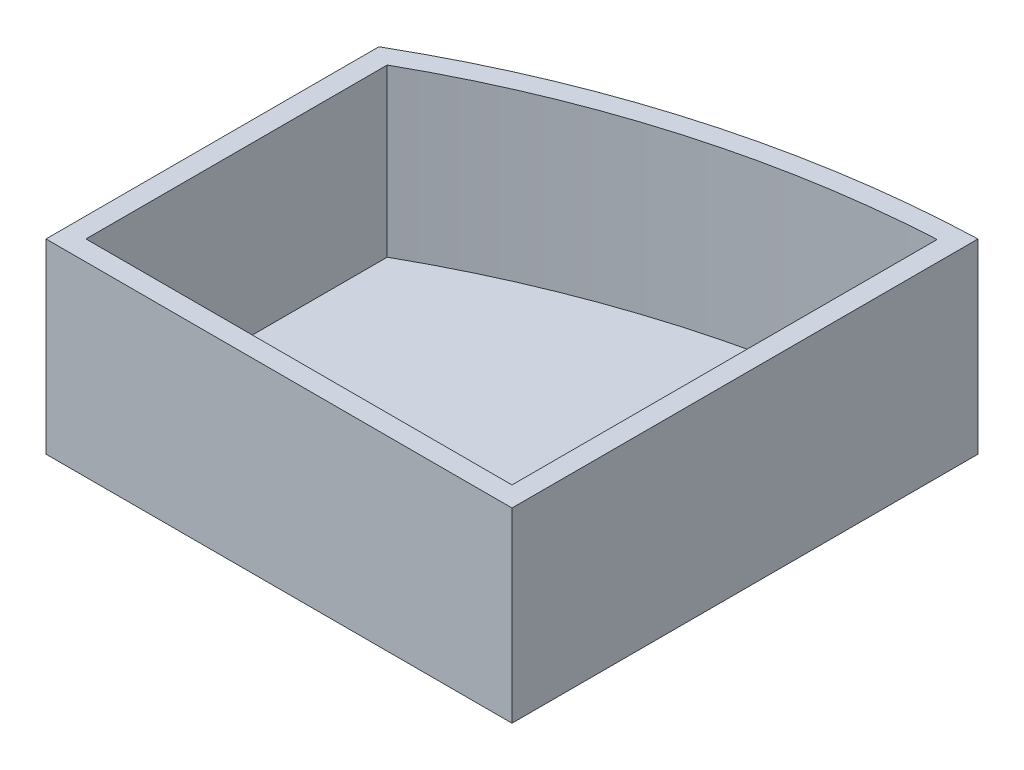
ISO-10303-21;
HEADER;
FILE_DESCRIPTION(('STEP AP214'),'2;1');
FILE_NAME('part.step','',(''),(''),'','','');
FILE_SCHEMA(('AUTOMOTIVE_DESIGN { 1 0 10303 214 1 1 1 1 }'));
ENDSEC;
DATA;
#1=APPLICATION_CONTEXT('core data for automotive mechanical design processes');
#2=APPLICATION_PROTOCOL_DEFINITION('international standard','automotive_design',2000,#1);
#3=PRODUCT_CONTEXT('',#1,'mechanical');
#4=PRODUCT('Part','Part','',(#3));
#5=PRODUCT_RELATED_PRODUCT_CATEGORY('part','',(#4));
#6=PRODUCT_DEFINITION_FORMATION('','',#4);
#7=PRODUCT_DEFINITION_CONTEXT('part definition',#1,'design');
#8=PRODUCT_DEFINITION('design','',#6,#7);
#9=PRODUCT_DEFINITION_SHAPE('','',#8);
#10=(LENGTH_UNIT() NAMED_UNIT(*) SI_UNIT(.MILLI.,.METRE.));
#11=(NAMED_UNIT(*) PLANE_ANGLE_UNIT() SI_UNIT($,.RADIAN.));
#12=(NAMED_UNIT(*) SI_UNIT($,.STERADIAN.) SOLID_ANGLE_UNIT());
#13=UNCERTAINTY_MEASURE_WITH_UNIT(LENGTH_MEASURE(1.E-05),#10,'distance_accuracy_value','');
#14=(GEOMETRIC_REPRESENTATION_CONTEXT(3) GLOBAL_UNCERTAINTY_ASSIGNED_CONTEXT((#13)) GLOBAL_UNIT_ASSIGNED_CONTEXT((#10,
#11,#12)) REPRESENTATION_CONTEXT('',''));
#15=CARTESIAN_POINT('',(0.,0.,0.));
#16=DIRECTION('',(0.,0.,1.));
#17=DIRECTION('',(1.,0.,0.));
#18=AXIS2_PLACEMENT_3D('',#15,#16,#17);
#19=CARTESIAN_POINT('',(4.97640813713975,3.,149.917428479989));
#20=DIRECTION('',(0.,-1.,0.));
#21=DIRECTION('',(0.,0.,-1.));
#22=AXIS2_PLACEMENT_3D('',#19,#20,#21);
#23=CYLINDRICAL_SURFACE('',#22,150.);
#24=CARTESIAN_POINT('',(-39.4352722138977,14.,6.64285764344005));
#25=CARTESIAN_POINT('',(-39.4352661378558,14.1391204526999,6.64285557621836));
#26=CARTESIAN_POINT('',(-39.4240042051214,14.2783424301615,6.63936332595704));
#27=CARTESIAN_POINT('',(-39.3792519349144,14.5529309436153,6.6255028643343));
#28=CARTESIAN_POINT('',(-39.3457348030674,14.6882926268329,6.6151263646228));
#29=CARTESIAN_POINT('',(-39.2574843881743,14.9511203089431,6.5878611484154));
#30=CARTESIAN_POINT('',(-39.2027662481043,15.0785918682179,6.57097708004327));
#31=CARTESIAN_POINT('',(-39.0737390700491,15.3221398232315,6.53127480797521));
#32=CARTESIAN_POINT('',(-38.9994345431717,15.4382188344478,6.50845797072231));
#33=CARTESIAN_POINT('',(-38.8329573921394,15.6564062962142,6.45751392229578));
#34=CARTESIAN_POINT('',(-38.7406956332331,15.7584405307272,6.42936023945238));
#35=CARTESIAN_POINT('',(-38.5411939475037,15.945097380428,6.3687288763975));
#36=CARTESIAN_POINT('',(-38.4339526784349,16.0297184336177,6.33625080870982));
#37=CARTESIAN_POINT('',(-38.2061856577479,16.1802102537094,6.26758377868781));
#38=CARTESIAN_POINT('',(-38.0855196087344,16.2458509252721,6.23135596827087));
#39=CARTESIAN_POINT('',(-37.8353408800564,16.3553578988955,6.15661609087296));
#40=CARTESIAN_POINT('',(-37.7058275890956,16.3992226946271,6.11810386607566));
#41=CARTESIAN_POINT('',(-37.4398337695133,16.4645040087501,6.03941803373275));
#42=CARTESIAN_POINT('',(-37.3032851410003,16.4856251057754,5.99922944469472));
#43=CARTESIAN_POINT('',(-37.0286013117552,16.5039045075355,5.91881854745724));
#44=CARTESIAN_POINT('',(-36.8904660189146,16.5010614140172,5.87859623742716));
#45=CARTESIAN_POINT('',(-36.6152381001323,16.4713863410853,5.7988811964371));
#46=CARTESIAN_POINT('',(-36.4781654784695,16.4443425740435,5.75939805502644));
#47=CARTESIAN_POINT('',(-36.2102141357334,16.3666998886487,5.68261443386599));
#48=CARTESIAN_POINT('',(-36.0793355418299,16.3161004869048,5.64531399892574));
#49=CARTESIAN_POINT('',(-35.8275496404278,16.1926855962764,5.57390014616989));
#50=CARTESIAN_POINT('',(-35.7066426515406,16.1198693978728,5.53978683018406));
#51=CARTESIAN_POINT('',(-35.4783954365672,15.9539736839042,5.47566532901625));
#52=CARTESIAN_POINT('',(-35.3710546049904,15.8608950732052,5.44565696061551));
#53=CARTESIAN_POINT('',(-35.1742563404689,15.6580908236282,5.39084098206329));
#54=CARTESIAN_POINT('',(-35.0846256863533,15.548547009611,5.36598286781711));
#55=CARTESIAN_POINT('',(-34.9246845223087,15.3151746577032,5.32175180257969));
#56=CARTESIAN_POINT('',(-34.8543721685614,15.1913474846782,5.30237832810643));
#57=CARTESIAN_POINT('',(-34.736337432395,14.9351341644833,5.26992057821461));
#58=CARTESIAN_POINT('',(-34.6882581181208,14.8029250404752,5.25673687449463));
#59=CARTESIAN_POINT('',(-34.6145396583722,14.5319432286052,5.23654401755608));
#60=CARTESIAN_POINT('',(-34.588898398147,14.3931711605901,5.22953428245038));
#61=CARTESIAN_POINT('',(-34.5611021297782,14.1151621351127,5.22193619181261));
#62=CARTESIAN_POINT('',(-34.5586119494381,13.975961097865,5.22125619662408));
#63=CARTESIAN_POINT('',(-34.5763214998191,13.6991234024498,5.22609611999887));
#64=CARTESIAN_POINT('',(-34.5965203203031,13.5614866817487,5.23161578984411));
#65=CARTESIAN_POINT('',(-34.6588177928371,13.2922948244945,5.24866927144723));
#66=CARTESIAN_POINT('',(-34.7008203464248,13.160715737541,5.26017669312297));
#67=CARTESIAN_POINT('',(-34.8053500470914,12.9066517240606,5.28888829332322));
#68=CARTESIAN_POINT('',(-34.8678777900923,12.7841670617051,5.30609263725054));
#69=CARTESIAN_POINT('',(-35.0121307774629,12.5506703357806,5.34591545753386));
#70=CARTESIAN_POINT('',(-35.094006230013,12.4397583572231,5.36857632376879));
#71=CARTESIAN_POINT('',(-35.2742303669975,12.2334882771246,5.41865745681315));
#72=CARTESIAN_POINT('',(-35.3725803381574,12.1381313916475,5.4460780953858));
#73=CARTESIAN_POINT('',(-35.584599354374,11.9640543247308,5.50545889802057));
#74=CARTESIAN_POINT('',(-35.6984871900949,11.8856229051472,5.53748433276731));
#75=CARTESIAN_POINT('',(-35.9370795572915,11.7493757492014,5.60491384812774));
#76=CARTESIAN_POINT('',(-36.0617850150802,11.6915617804825,5.64031821810575));
#77=CARTESIAN_POINT('',(-36.3205379932414,11.5972953397285,5.71416706465439));
#78=CARTESIAN_POINT('',(-36.4547005839215,11.5611888292048,5.75265023816349));
#79=CARTESIAN_POINT('',(-36.726820083081,11.5127086733032,5.83113209878094));
#80=CARTESIAN_POINT('',(-36.8647772096191,11.5003363947524,5.87113087303574));
#81=CARTESIAN_POINT('',(-37.1417296113058,11.4996745829474,5.95186510440521));
#82=CARTESIAN_POINT('',(-37.2807244347679,11.511576989214,5.99260388887457));
#83=CARTESIAN_POINT('',(-37.5547007795225,11.5595823865596,6.07332822813733));
#84=CARTESIAN_POINT('',(-37.6896822912173,11.5956854355088,6.11331378112931));
#85=CARTESIAN_POINT('',(-37.9514410612919,11.6910589473878,6.19123608201414));
#86=CARTESIAN_POINT('',(-38.0782370342405,11.7502742123099,6.22917746802595));
#87=CARTESIAN_POINT('',(-38.320273151232,11.8903057957601,6.30192313180717));
#88=CARTESIAN_POINT('',(-38.4355143084968,11.9711202180135,6.33672768461296));
#89=CARTESIAN_POINT('',(-38.6498899237178,12.1511779501889,6.40172008169133));
#90=CARTESIAN_POINT('',(-38.7491805560529,12.2502192007601,6.43195249588405));
#91=CARTESIAN_POINT('',(-38.9301641854204,12.4645551664999,6.48722982131354));
#92=CARTESIAN_POINT('',(-39.0118540000426,12.5798528147692,6.51227379439498));
#93=CARTESIAN_POINT('',(-39.1542158624169,12.821821453772,6.55601972691995));
#94=CARTESIAN_POINT('',(-39.2151404561155,12.9483303149642,6.57479782794521));
#95=CARTESIAN_POINT('',(-39.3154925731034,13.2102351020238,6.605773973985));
#96=CARTESIAN_POINT('',(-39.3549478101924,13.345619316801,6.61798050172232));
#97=CARTESIAN_POINT('',(-39.4004322775486,13.5682683287654,6.63206168406916));
#98=CARTESIAN_POINT('',(-39.4134801463308,13.6540304651104,6.6361041473445));
#99=CARTESIAN_POINT('',(-39.4309019823923,13.8265152427062,6.64150276334896));
#100=CARTESIAN_POINT('',(-39.435276003206,13.9132378780256,6.64285893265768));
#101=CARTESIAN_POINT('',(-39.4352722138977,14.,6.64285764344005));
#102=B_SPLINE_CURVE_WITH_KNOTS('',3,(#24,#25,#26,#27,#28,#29,#30,#31,#32,#33,#34,#35,#36,#37,
#38,#39,#40,#41,#42,#43,#44,#45,#46,#47,#48,#49,#50,#51,#52,#53,#54,#55,#56,#57,#58,#59,#60,#61,
#62,#63,#64,#65,#66,#67,#68,#69,#70,#71,#72,#73,#74,#75,#76,#77,#78,#79,#80,#81,#82,#83,#84,#85,
#86,#87,#88,#89,#90,#91,#92,#93,#94,#95,#96,#97,#98,#99,#100,#101),.UNSPECIFIED.,.T.,.F.,(4,2,2,
2,2,2,2,2,2,2,2,2,2,2,2,2,2,2,2,2,2,2,2,2,2,2,2,2,2,2,2,2,2,2,2,2,2,2,4),(0.,0.417042780520206,
0.834588576588948,1.25183668565513,1.66898877859018,2.0882668872295,2.50758258960009,
2.93178675014822,3.35602025060095,3.78570007582062,4.21540497200092,4.6489075269858,
5.08241897837409,5.51594427589905,5.94945021729386,6.37847970578335,6.80746823169316,
7.22930772131665,7.65110744895569,8.06679084655338,8.48245756836499,8.89630762958837,
9.31016970746893,9.72735701073863,10.1445769132027,10.5684333926567,10.9923262028417,
11.4228070809188,11.8533127491515,12.2872356133682,12.7211595152166,13.1540533729255,
13.5869092376611,14.0152277247741,14.4436235914367,14.8666060505119,15.2890411979366,
15.5491304890054,15.8092181748187),.UNSPECIFIED.);
#103=CARTESIAN_POINT('',(-39.4352722138977,14.,6.64285764344005));
#104=VERTEX_POINT('',#103);
#105=EDGE_CURVE('E129',#104,#104,#102,.T.);
#106=ORIENTED_EDGE('',*,*,#105,.F.);
#107=EDGE_LOOP('',(#106));
#108=FACE_BOUND('',#107,.T.);
#109=CARTESIAN_POINT('',(4.97640813713975,0.,149.917428479989));
#110=DIRECTION('',(0.,1.,0.));
#111=DIRECTION('',(0.,0.,1.));
#112=AXIS2_PLACEMENT_3D('',#109,#110,#111);
#113=CIRCLE('',#112,150.);
#114=CARTESIAN_POINT('',(0.,0.,0.));
#115=VERTEX_POINT('',#114);
#116=CARTESIAN_POINT('',(-70.,0.,20.));
#117=VERTEX_POINT('',#116);
#118=EDGE_CURVE('E150',#115,#117,#113,.T.);
#119=ORIENTED_EDGE('',*,*,#118,.T.);
#120=DIRECTION('',(0.,-1.,0.));
#121=VECTOR('',#120,1.);
#122=CARTESIAN_POINT('',(-70.,3.,20.));
#123=LINE('',#122,#121);
#124=CARTESIAN_POINT('',(-70.,28.,20.));
#125=VERTEX_POINT('',#124);
#126=EDGE_CURVE('E11',#125,#117,#123,.T.);
#127=ORIENTED_EDGE('',*,*,#126,.F.);
#128=CARTESIAN_POINT('',(4.97640813713975,28.,149.917428479989));
#129=DIRECTION('',(0.,1.,0.));
#130=DIRECTION('',(0.,0.,1.));
#131=AXIS2_PLACEMENT_3D('',#128,#129,#130);
#132=CIRCLE('',#131,150.);
#133=CARTESIAN_POINT('',(0.,28.,0.));
#134=VERTEX_POINT('',#133);
#135=EDGE_CURVE('E147',#134,#125,#132,.T.);
#136=ORIENTED_EDGE('',*,*,#135,.F.);
#137=DIRECTION('',(0.,-1.,0.));
#138=VECTOR('',#137,1.);
#139=CARTESIAN_POINT('',(0.,3.,0.));
#140=LINE('',#139,#138);
#141=EDGE_CURVE('E159',#134,#115,#140,.T.);
#142=ORIENTED_EDGE('',*,*,#141,.T.);
#143=EDGE_LOOP('',(#119,#127,#136,#142));
#144=FACE_BOUND('',#143,.T.);
#145=ADVANCED_FACE('F37',(#108,#144),#23,.T.);
#146=CARTESIAN_POINT('',(-70.,3.,70.));
#147=DIRECTION('',(1.,0.,0.));
#148=DIRECTION('',(0.,0.,-1.));
#149=AXIS2_PLACEMENT_3D('',#146,#147,#148);
#150=PLANE('',#149);
#151=DIRECTION('',(0.,0.,1.));
#152=VECTOR('',#151,1.);
#153=CARTESIAN_POINT('',(-70.,0.,70.));
#154=LINE('',#153,#152);
#155=CARTESIAN_POINT('',(-70.,0.,70.));
#156=VERTEX_POINT('',#155);
#157=EDGE_CURVE('E153',#117,#156,#154,.T.);
#158=ORIENTED_EDGE('',*,*,#157,.T.);
#159=DIRECTION('',(0.,-1.,0.));
#160=VECTOR('',#159,1.);
#161=CARTESIAN_POINT('',(-70.,3.,70.));
#162=LINE('',#161,#160);
#163=CARTESIAN_POINT('',(-70.,28.,70.));
#164=VERTEX_POINT('',#163);
#165=EDGE_CURVE('E44',#164,#156,#162,.T.);
#166=ORIENTED_EDGE('',*,*,#165,.F.);
#167=DIRECTION('',(0.,0.,1.));
#168=VECTOR('',#167,1.);
#169=CARTESIAN_POINT('',(-70.,28.,20.));
#170=LINE('',#169,#168);
#171=EDGE_CURVE('E115',#125,#164,#170,.T.);
#172=ORIENTED_EDGE('',*,*,#171,.F.);
#173=ORIENTED_EDGE('',*,*,#126,.T.);
#174=EDGE_LOOP('',(#158,#166,#172,#173));
#175=FACE_BOUND('',#174,.T.);
#176=ADVANCED_FACE('F181',(#175),#150,.F.);
#177=CARTESIAN_POINT('',(0.,3.,70.));
#178=DIRECTION('',(0.,0.,-1.));
#179=DIRECTION('',(-1.,0.,0.));
#180=AXIS2_PLACEMENT_3D('',#177,#178,#179);
#181=PLANE('',#180);
#182=DIRECTION('',(1.,0.,0.));
#183=VECTOR('',#182,1.);
#184=CARTESIAN_POINT('',(0.,0.,70.));
#185=LINE('',#184,#183);
#186=CARTESIAN_POINT('',(0.,0.,70.));
#187=VERTEX_POINT('',#186);
#188=EDGE_CURVE('E155',#156,#187,#185,.T.);
#189=ORIENTED_EDGE('',*,*,#188,.T.);
#190=DIRECTION('',(0.,-1.,0.));
#191=VECTOR('',#190,1.);
#192=CARTESIAN_POINT('',(0.,3.,70.));
#193=LINE('',#192,#191);
#194=CARTESIAN_POINT('',(0.,28.,70.));
#195=VERTEX_POINT('',#194);
#196=EDGE_CURVE('E162',#195,#187,#193,.T.);
#197=ORIENTED_EDGE('',*,*,#196,.F.);
#198=DIRECTION('',(1.,0.,0.));
#199=VECTOR('',#198,1.);
#200=CARTESIAN_POINT('',(-70.,28.,70.));
#201=LINE('',#200,#199);
#202=EDGE_CURVE('E141',#164,#195,#201,.T.);
#203=ORIENTED_EDGE('',*,*,#202,.F.);
#204=ORIENTED_EDGE('',*,*,#165,.T.);
#205=EDGE_LOOP('',(#189,#197,#203,#204));
#206=FACE_BOUND('',#205,.T.);
#207=ADVANCED_FACE('F168',(#206),#181,.F.);
#208=CARTESIAN_POINT('',(0.,3.,0.));
#209=DIRECTION('',(-1.,0.,0.));
#210=DIRECTION('',(0.,0.,1.));
#211=AXIS2_PLACEMENT_3D('',#208,#209,#210);
#212=PLANE('',#211);
#213=DIRECTION('',(0.,0.,-1.));
#214=VECTOR('',#213,1.);
#215=CARTESIAN_POINT('',(0.,0.,0.));
#216=LINE('',#215,#214);
#217=EDGE_CURVE('E157',#187,#115,#216,.T.);
#218=ORIENTED_EDGE('',*,*,#217,.T.);
#219=ORIENTED_EDGE('',*,*,#141,.F.);
#220=DIRECTION('',(0.,0.,-1.));
#221=VECTOR('',#220,1.);
#222=CARTESIAN_POINT('',(0.,28.,70.));
#223=LINE('',#222,#221);
#224=EDGE_CURVE('E144',#195,#134,#223,.T.);
#225=ORIENTED_EDGE('',*,*,#224,.F.);
#226=ORIENTED_EDGE('',*,*,#196,.T.);
#227=EDGE_LOOP('',(#218,#219,#225,#226));
#228=FACE_BOUND('',#227,.T.);
#229=ADVANCED_FACE('F176',(#228),#212,.F.);
#230=CARTESIAN_POINT('',(4.97640813713975,0.,149.917428479989));
#231=DIRECTION('',(0.,1.,0.));
#232=DIRECTION('',(0.,0.,1.));
#233=AXIS2_PLACEMENT_3D('',#230,#231,#232);
#234=PLANE('',#233);
#235=ORIENTED_EDGE('',*,*,#118,.F.);
#236=ORIENTED_EDGE('',*,*,#217,.F.);
#237=ORIENTED_EDGE('',*,*,#188,.F.);
#238=ORIENTED_EDGE('',*,*,#157,.F.);
#239=EDGE_LOOP('',(#235,#236,#237,#238));
#240=FACE_BOUND('',#239,.T.);
#241=ADVANCED_FACE('F174',(#240),#234,.F.);
#242=CARTESIAN_POINT('',(4.97640813713975,28.,149.917428479989));
#243=DIRECTION('',(0.,1.,0.));
#244=DIRECTION('',(0.,0.,1.));
#245=AXIS2_PLACEMENT_3D('',#242,#243,#244);
#246=PLANE('',#245);
#247=ORIENTED_EDGE('',*,*,#171,.T.);
#248=ORIENTED_EDGE('',*,*,#202,.T.);
#249=ORIENTED_EDGE('',*,*,#224,.T.);
#250=ORIENTED_EDGE('',*,*,#135,.T.);
#251=EDGE_LOOP('',(#247,#248,#249,#250));
#252=FACE_BOUND('',#251,.T.);
#253=DIRECTION('',(0.,0.,1.));
#254=VECTOR('',#253,1.);
#255=CARTESIAN_POINT('',(-67.,28.,21.7441213069434));
#256=LINE('',#255,#254);
#257=CARTESIAN_POINT('',(-67.,28.,21.7441213069434));
#258=VERTEX_POINT('',#257);
#259=CARTESIAN_POINT('',(-67.,28.,67.));
#260=VERTEX_POINT('',#259);
#261=EDGE_CURVE('E109',#258,#260,#256,.T.);
#262=ORIENTED_EDGE('',*,*,#261,.F.);
#263=CARTESIAN_POINT('',(4.97640813713975,28.,149.917428479989));
#264=DIRECTION('',(0.,1.,0.));
#265=DIRECTION('',(0.,0.,1.));
#266=AXIS2_PLACEMENT_3D('',#263,#264,#265);
#267=CIRCLE('',#266,147.);
#268=CARTESIAN_POINT('',(-3.,28.,3.13399306158158));
#269=VERTEX_POINT('',#268);
#270=EDGE_CURVE('E100',#269,#258,#267,.T.);
#271=ORIENTED_EDGE('',*,*,#270,.F.);
#272=DIRECTION('',(0.,0.,-1.));
#273=VECTOR('',#272,1.);
#274=CARTESIAN_POINT('',(-2.99999999999999,28.,67.));
#275=LINE('',#274,#273);
#276=CARTESIAN_POINT('',(-2.99999999999999,28.,67.));
#277=VERTEX_POINT('',#276);
#278=EDGE_CURVE('E123',#277,#269,#275,.T.);
#279=ORIENTED_EDGE('',*,*,#278,.F.);
#280=DIRECTION('',(1.,0.,0.));
#281=VECTOR('',#280,1.);
#282=CARTESIAN_POINT('',(-67.,28.,67.));
#283=LINE('',#282,#281);
#284=EDGE_CURVE('E121',#260,#277,#283,.T.);
#285=ORIENTED_EDGE('',*,*,#284,.F.);
#286=EDGE_LOOP('',(#262,#271,#279,#285));
#287=FACE_BOUND('',#286,.T.);
#288=ADVANCED_FACE('F119',(#252,#287),#246,.T.);
#289=CARTESIAN_POINT('',(4.97640813713975,28.,149.917428479989));
#290=DIRECTION('',(0.,-1.,0.));
#291=DIRECTION('',(0.,0.,-1.));
#292=AXIS2_PLACEMENT_3D('',#289,#290,#291);
#293=CYLINDRICAL_SURFACE('',#292,147.);
#294=CARTESIAN_POINT('',(4.97640813713975,3.,149.917428479989));
#295=DIRECTION('',(0.,1.,0.));
#296=DIRECTION('',(0.,0.,1.));
#297=AXIS2_PLACEMENT_3D('',#294,#295,#296);
#298=CIRCLE('',#297,147.);
#299=CARTESIAN_POINT('',(-3.,3.,3.13399306158157));
#300=VERTEX_POINT('',#299);
#301=CARTESIAN_POINT('',(-67.,3.,21.7441213069434));
#302=VERTEX_POINT('',#301);
#303=EDGE_CURVE('E51',#300,#302,#298,.T.);
#304=ORIENTED_EDGE('',*,*,#303,.F.);
#305=DIRECTION('',(0.,-1.,0.));
#306=VECTOR('',#305,1.);
#307=CARTESIAN_POINT('',(-3.,28.,3.13399306158158));
#308=LINE('',#307,#306);
#309=EDGE_CURVE('E105',#269,#300,#308,.T.);
#310=ORIENTED_EDGE('',*,*,#309,.F.);
#311=ORIENTED_EDGE('',*,*,#270,.T.);
#312=DIRECTION('',(0.,-1.,0.));
#313=VECTOR('',#312,1.);
#314=CARTESIAN_POINT('',(-67.,28.,21.7441213069434));
#315=LINE('',#314,#313);
#316=EDGE_CURVE('E103',#258,#302,#315,.T.);
#317=ORIENTED_EDGE('',*,*,#316,.T.);
#318=EDGE_LOOP('',(#304,#310,#311,#317));
#319=FACE_BOUND('',#318,.T.);
#320=ADVANCED_FACE('F102',(#319),#293,.F.);
#321=CARTESIAN_POINT('',(-67.,28.,21.7441213069434));
#322=DIRECTION('',(1.,0.,0.));
#323=DIRECTION('',(0.,0.,-1.));
#324=AXIS2_PLACEMENT_3D('',#321,#322,#323);
#325=PLANE('',#324);
#326=DIRECTION('',(0.,0.,1.));
#327=VECTOR('',#326,1.);
#328=CARTESIAN_POINT('',(-67.,3.,21.7441213069434));
#329=LINE('',#328,#327);
#330=CARTESIAN_POINT('',(-67.,3.,67.));
#331=VERTEX_POINT('',#330);
#332=EDGE_CURVE('E55',#302,#331,#329,.T.);
#333=ORIENTED_EDGE('',*,*,#332,.F.);
#334=ORIENTED_EDGE('',*,*,#316,.F.);
#335=ORIENTED_EDGE('',*,*,#261,.T.);
#336=DIRECTION('',(0.,-1.,0.));
#337=VECTOR('',#336,1.);
#338=CARTESIAN_POINT('',(-67.,28.,67.));
#339=LINE('',#338,#337);
#340=EDGE_CURVE('E116',#260,#331,#339,.T.);
#341=ORIENTED_EDGE('',*,*,#340,.T.);
#342=EDGE_LOOP('',(#333,#334,#335,#341));
#343=FACE_BOUND('',#342,.T.);
#344=ADVANCED_FACE('F113',(#343),#325,.T.);
#345=CARTESIAN_POINT('',(-67.,28.,67.));
#346=DIRECTION('',(0.,0.,-1.));
#347=DIRECTION('',(-1.,0.,0.));
#348=AXIS2_PLACEMENT_3D('',#345,#346,#347);
#349=PLANE('',#348);
#350=DIRECTION('',(1.,0.,0.));
#351=VECTOR('',#350,1.);
#352=CARTESIAN_POINT('',(-67.,3.,67.));
#353=LINE('',#352,#351);
#354=CARTESIAN_POINT('',(-2.99999999999999,3.,67.));
#355=VERTEX_POINT('',#354);
#356=EDGE_CURVE('E131',#331,#355,#353,.T.);
#357=ORIENTED_EDGE('',*,*,#356,.F.);
#358=ORIENTED_EDGE('',*,*,#340,.F.);
#359=ORIENTED_EDGE('',*,*,#284,.T.);
#360=DIRECTION('',(0.,-1.,0.));
#361=VECTOR('',#360,1.);
#362=CARTESIAN_POINT('',(-2.99999999999999,28.,67.));
#363=LINE('',#362,#361);
#364=EDGE_CURVE('E135',#277,#355,#363,.T.);
#365=ORIENTED_EDGE('',*,*,#364,.T.);
#366=EDGE_LOOP('',(#357,#358,#359,#365));
#367=FACE_BOUND('',#366,.T.);
#368=ADVANCED_FACE('F205',(#367),#349,.T.);
#369=CARTESIAN_POINT('',(-2.99999999999999,28.,67.));
#370=DIRECTION('',(-1.,0.,0.));
#371=DIRECTION('',(0.,0.,1.));
#372=AXIS2_PLACEMENT_3D('',#369,#370,#371);
#373=PLANE('',#372);
#374=DIRECTION('',(0.,0.,-1.));
#375=VECTOR('',#374,1.);
#376=CARTESIAN_POINT('',(-2.99999999999999,3.,67.));
#377=LINE('',#376,#375);
#378=EDGE_CURVE('E110',#355,#300,#377,.T.);
#379=ORIENTED_EDGE('',*,*,#378,.F.);
#380=ORIENTED_EDGE('',*,*,#364,.F.);
#381=ORIENTED_EDGE('',*,*,#278,.T.);
#382=ORIENTED_EDGE('',*,*,#309,.T.);
#383=EDGE_LOOP('',(#379,#380,#381,#382));
#384=FACE_BOUND('',#383,.T.);
#385=ADVANCED_FACE('F198',(#384),#373,.T.);
#386=CARTESIAN_POINT('',(4.97640813713975,3.,149.917428479989));
#387=DIRECTION('',(0.,1.,0.));
#388=DIRECTION('',(0.,0.,1.));
#389=AXIS2_PLACEMENT_3D('',#386,#387,#388);
#390=PLANE('',#389);
#391=ORIENTED_EDGE('',*,*,#303,.T.);
#392=ORIENTED_EDGE('',*,*,#332,.T.);
#393=ORIENTED_EDGE('',*,*,#356,.T.);
#394=ORIENTED_EDGE('',*,*,#378,.T.);
#395=EDGE_LOOP('',(#391,#392,#393,#394));
#396=FACE_BOUND('',#395,.T.);
#397=ADVANCED_FACE('F194',(#396),#390,.T.);
#398=CARTESIAN_POINT('',(-4.44180275379959,14.,72.184966364864));
#399=DIRECTION('',(-0.441034052986209,0.,-0.897490369924134));
#400=DIRECTION('',(-0.897490369924133,0.,0.441034052986209));
#401=AXIS2_PLACEMENT_3D('',#398,#399,#400);
#402=CYLINDRICAL_SURFACE('',#401,2.5);
#403=ORIENTED_EDGE('',*,*,#105,.T.);
#404=EDGE_LOOP('',(#403));
#405=FACE_BOUND('',#404,.T.);
#406=CARTESIAN_POINT('',(-41.0838433839493,14.,-2.38042915790883));
#407=DIRECTION('',(-0.441034052986209,0.,-0.897490369924134));
#408=DIRECTION('',(-0.897490369924134,0.,0.441034052986209));
#409=AXIS2_PLACEMENT_3D('',#406,#407,#408);
#410=CIRCLE('',#409,2.5);
#411=CARTESIAN_POINT('',(-43.3275693087596,14.,-1.27784402544331));
#412=VERTEX_POINT('',#411);
#413=EDGE_CURVE('E224',#412,#412,#410,.T.);
#414=ORIENTED_EDGE('',*,*,#413,.F.);
#415=EDGE_LOOP('',(#414));
#416=FACE_BOUND('',#415,.T.);
#417=ADVANCED_FACE('F197',(#405,#416),#402,.T.);
#418=CARTESIAN_POINT('',(-41.0838433839493,14.,-2.38042915790883));
#419=DIRECTION('',(-0.441034052986209,0.,-0.897490369924134));
#420=DIRECTION('',(-0.897490369924134,0.,0.441034052986209));
#421=AXIS2_PLACEMENT_3D('',#418,#419,#420);
#422=PLANE('',#421);
#423=ORIENTED_EDGE('',*,*,#413,.T.);
#424=EDGE_LOOP('',(#423));
#425=FACE_BOUND('',#424,.T.);
#426=ADVANCED_FACE('F215',(#425),#422,.T.);
#427=CLOSED_SHELL('',(#145,#176,#207,#229,#241,#288,#320,#344,#368,#385,#397,#417,#426));
#428=MANIFOLD_SOLID_BREP('B2',#427);
#429=ADVANCED_BREP_SHAPE_REPRESENTATION('',(#18,#428),#14);
#430=SHAPE_DEFINITION_REPRESENTATION(#9,#429);
ENDSEC;
END-ISO-10303-21;
